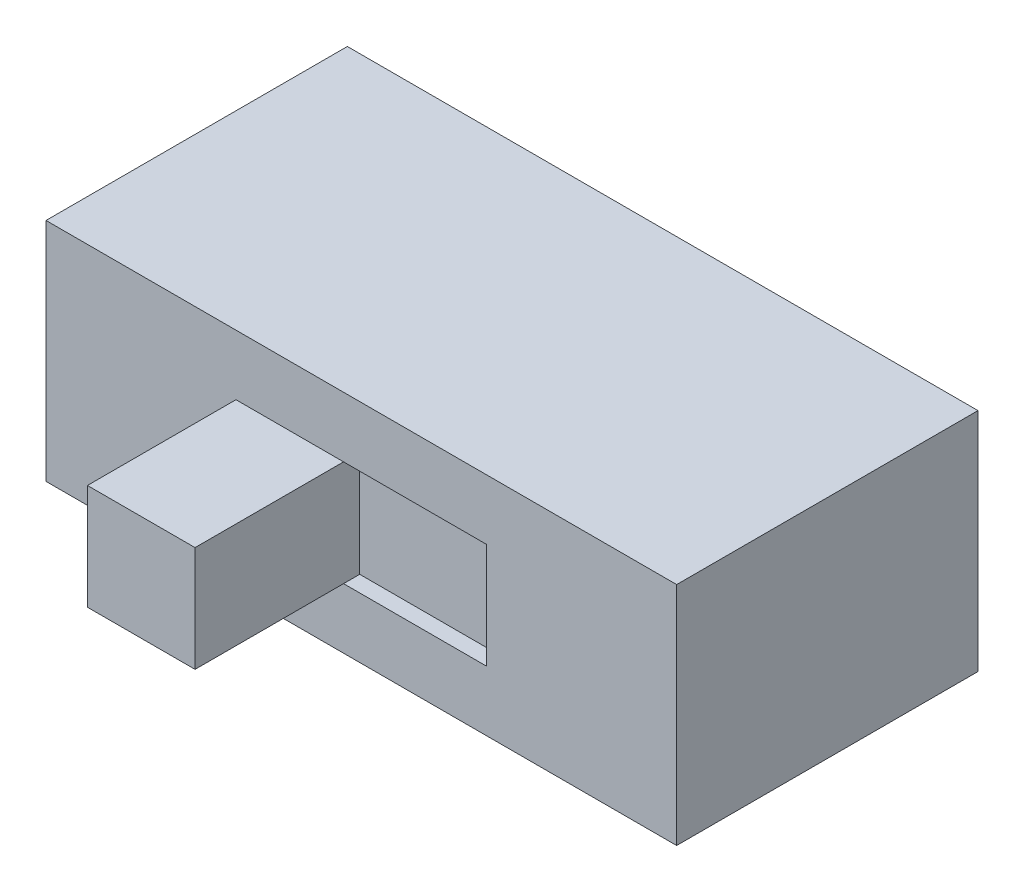
ISO-10303-21;
HEADER;
FILE_DESCRIPTION(('STEP AP214'),'2;1');
FILE_NAME('part.step','',(''),(''),'','','');
FILE_SCHEMA(('AUTOMOTIVE_DESIGN { 1 0 10303 214 1 1 1 1 }'));
ENDSEC;
DATA;
#1=APPLICATION_CONTEXT('core data for automotive mechanical design processes');
#2=APPLICATION_PROTOCOL_DEFINITION('international standard','automotive_design',2000,#1);
#3=PRODUCT_CONTEXT('',#1,'mechanical');
#4=PRODUCT('Part','Part','',(#3));
#5=PRODUCT_RELATED_PRODUCT_CATEGORY('part','',(#4));
#6=PRODUCT_DEFINITION_FORMATION('','',#4);
#7=PRODUCT_DEFINITION_CONTEXT('part definition',#1,'design');
#8=PRODUCT_DEFINITION('design','',#6,#7);
#9=PRODUCT_DEFINITION_SHAPE('','',#8);
#10=(LENGTH_UNIT() NAMED_UNIT(*) SI_UNIT(.MILLI.,.METRE.));
#11=(NAMED_UNIT(*) PLANE_ANGLE_UNIT() SI_UNIT($,.RADIAN.));
#12=(NAMED_UNIT(*) SI_UNIT($,.STERADIAN.) SOLID_ANGLE_UNIT());
#13=UNCERTAINTY_MEASURE_WITH_UNIT(LENGTH_MEASURE(1.E-05),#10,'distance_accuracy_value','');
#14=(GEOMETRIC_REPRESENTATION_CONTEXT(3) GLOBAL_UNCERTAINTY_ASSIGNED_CONTEXT((#13)) GLOBAL_UNIT_ASSIGNED_CONTEXT((#10,
#11,#12)) REPRESENTATION_CONTEXT('',''));
#15=CARTESIAN_POINT('',(0.,0.,0.));
#16=DIRECTION('',(0.,0.,1.));
#17=DIRECTION('',(1.,0.,0.));
#18=AXIS2_PLACEMENT_3D('',#15,#16,#17);
#19=CARTESIAN_POINT('',(5.86000000000001,4.2,-2.8));
#20=DIRECTION('',(-1.,0.,0.));
#21=DIRECTION('',(0.,0.,1.));
#22=AXIS2_PLACEMENT_3D('',#19,#20,#21);
#23=PLANE('',#22);
#24=DIRECTION('',(0.,0.,-1.));
#25=VECTOR('',#24,1.);
#26=CARTESIAN_POINT('',(5.86000000000001,0.,-2.8));
#27=LINE('',#26,#25);
#28=CARTESIAN_POINT('',(5.86000000000001,0.,2.8));
#29=VERTEX_POINT('',#28);
#30=CARTESIAN_POINT('',(5.86000000000001,0.,-2.8));
#31=VERTEX_POINT('',#30);
#32=EDGE_CURVE('E254',#29,#31,#27,.T.);
#33=ORIENTED_EDGE('',*,*,#32,.T.);
#34=DIRECTION('',(0.,-1.,0.));
#35=VECTOR('',#34,1.);
#36=CARTESIAN_POINT('',(5.86000000000001,4.2,-2.8));
#37=LINE('',#36,#35);
#38=CARTESIAN_POINT('',(5.86000000000001,4.2,-2.8));
#39=VERTEX_POINT('',#38);
#40=EDGE_CURVE('E11',#39,#31,#37,.T.);
#41=ORIENTED_EDGE('',*,*,#40,.F.);
#42=DIRECTION('',(0.,0.,-1.));
#43=VECTOR('',#42,1.);
#44=CARTESIAN_POINT('',(5.86000000000001,4.2,-2.8));
#45=LINE('',#44,#43);
#46=CARTESIAN_POINT('',(5.86000000000001,4.2,2.8));
#47=VERTEX_POINT('',#46);
#48=EDGE_CURVE('E258',#47,#39,#45,.T.);
#49=ORIENTED_EDGE('',*,*,#48,.F.);
#50=DIRECTION('',(0.,-1.,0.));
#51=VECTOR('',#50,1.);
#52=CARTESIAN_POINT('',(5.86000000000001,4.2,2.8));
#53=LINE('',#52,#51);
#54=EDGE_CURVE('E266',#47,#29,#53,.T.);
#55=ORIENTED_EDGE('',*,*,#54,.T.);
#56=EDGE_LOOP('',(#33,#41,#49,#55));
#57=FACE_BOUND('',#56,.T.);
#58=ADVANCED_FACE('F52',(#57),#23,.F.);
#59=CARTESIAN_POINT('',(-5.85999999999999,4.2,-2.8));
#60=DIRECTION('',(0.,0.,1.));
#61=DIRECTION('',(1.,0.,0.));
#62=AXIS2_PLACEMENT_3D('',#59,#60,#61);
#63=PLANE('',#62);
#64=DIRECTION('',(-1.,0.,0.));
#65=VECTOR('',#64,1.);
#66=CARTESIAN_POINT('',(-5.85999999999999,0.,-2.8));
#67=LINE('',#66,#65);
#68=CARTESIAN_POINT('',(-5.85999999999999,0.,-2.8));
#69=VERTEX_POINT('',#68);
#70=EDGE_CURVE('E269',#31,#69,#67,.T.);
#71=ORIENTED_EDGE('',*,*,#70,.T.);
#72=DIRECTION('',(0.,-1.,0.));
#73=VECTOR('',#72,1.);
#74=CARTESIAN_POINT('',(-5.85999999999999,4.2,-2.8));
#75=LINE('',#74,#73);
#76=CARTESIAN_POINT('',(-5.85999999999999,4.2,-2.8));
#77=VERTEX_POINT('',#76);
#78=EDGE_CURVE('E62',#77,#69,#75,.T.);
#79=ORIENTED_EDGE('',*,*,#78,.F.);
#80=DIRECTION('',(-1.,0.,0.));
#81=VECTOR('',#80,1.);
#82=CARTESIAN_POINT('',(-5.85999999999999,4.2,-2.8));
#83=LINE('',#82,#81);
#84=EDGE_CURVE('E117',#39,#77,#83,.T.);
#85=ORIENTED_EDGE('',*,*,#84,.F.);
#86=ORIENTED_EDGE('',*,*,#40,.T.);
#87=EDGE_LOOP('',(#71,#79,#85,#86));
#88=FACE_BOUND('',#87,.T.);
#89=ADVANCED_FACE('F308',(#88),#63,.F.);
#90=CARTESIAN_POINT('',(-5.85999999999999,4.2,-2.8));
#91=DIRECTION('',(1.,0.,0.));
#92=DIRECTION('',(0.,0.,-1.));
#93=AXIS2_PLACEMENT_3D('',#90,#91,#92);
#94=PLANE('',#93);
#95=DIRECTION('',(0.,0.,1.));
#96=VECTOR('',#95,1.);
#97=CARTESIAN_POINT('',(-5.85999999999999,0.,-2.8));
#98=LINE('',#97,#96);
#99=CARTESIAN_POINT('',(-5.85999999999999,0.,2.8));
#100=VERTEX_POINT('',#99);
#101=EDGE_CURVE('E272',#69,#100,#98,.T.);
#102=ORIENTED_EDGE('',*,*,#101,.T.);
#103=DIRECTION('',(0.,-1.,0.));
#104=VECTOR('',#103,1.);
#105=CARTESIAN_POINT('',(-5.85999999999999,4.2,2.8));
#106=LINE('',#105,#104);
#107=CARTESIAN_POINT('',(-5.85999999999999,4.2,2.8));
#108=VERTEX_POINT('',#107);
#109=EDGE_CURVE('E278',#108,#100,#106,.T.);
#110=ORIENTED_EDGE('',*,*,#109,.F.);
#111=DIRECTION('',(0.,0.,1.));
#112=VECTOR('',#111,1.);
#113=CARTESIAN_POINT('',(-5.85999999999999,4.2,-2.8));
#114=LINE('',#113,#112);
#115=EDGE_CURVE('E261',#77,#108,#114,.T.);
#116=ORIENTED_EDGE('',*,*,#115,.F.);
#117=ORIENTED_EDGE('',*,*,#78,.T.);
#118=EDGE_LOOP('',(#102,#110,#116,#117));
#119=FACE_BOUND('',#118,.T.);
#120=ADVANCED_FACE('F289',(#119),#94,.F.);
#121=CARTESIAN_POINT('',(-5.85999999999999,4.2,2.8));
#122=DIRECTION('',(0.,0.,-1.));
#123=DIRECTION('',(-1.,0.,0.));
#124=AXIS2_PLACEMENT_3D('',#121,#122,#123);
#125=PLANE('',#124);
#126=DIRECTION('',(1.,0.,0.));
#127=VECTOR('',#126,1.);
#128=CARTESIAN_POINT('',(0.,3.08,2.8));
#129=LINE('',#128,#127);
#130=CARTESIAN_POINT('',(-2.32999999999999,3.08,2.8));
#131=VERTEX_POINT('',#130);
#132=CARTESIAN_POINT('',(-0.329999999999994,3.08,2.8));
#133=VERTEX_POINT('',#132);
#134=EDGE_CURVE('E209',#131,#133,#129,.T.);
#135=ORIENTED_EDGE('',*,*,#134,.T.);
#136=DIRECTION('',(1.,0.,0.));
#137=VECTOR('',#136,1.);
#138=CARTESIAN_POINT('',(0.,3.08,2.8));
#139=LINE('',#138,#137);
#140=CARTESIAN_POINT('',(2.33000000000001,3.08,2.8));
#141=VERTEX_POINT('',#140);
#142=EDGE_CURVE('E198',#133,#141,#139,.T.);
#143=ORIENTED_EDGE('',*,*,#142,.T.);
#144=DIRECTION('',(0.,-1.,0.));
#145=VECTOR('',#144,1.);
#146=CARTESIAN_POINT('',(2.33000000000001,0.,2.8));
#147=LINE('',#146,#145);
#148=CARTESIAN_POINT('',(2.33000000000001,1.12,2.8));
#149=VERTEX_POINT('',#148);
#150=EDGE_CURVE('E183',#141,#149,#147,.T.);
#151=ORIENTED_EDGE('',*,*,#150,.T.);
#152=DIRECTION('',(1.,0.,0.));
#153=VECTOR('',#152,1.);
#154=CARTESIAN_POINT('',(0.,1.12,2.8));
#155=LINE('',#154,#153);
#156=CARTESIAN_POINT('',(-0.329999999999994,1.12,2.8));
#157=VERTEX_POINT('',#156);
#158=EDGE_CURVE('E72',#157,#149,#155,.T.);
#159=ORIENTED_EDGE('',*,*,#158,.F.);
#160=DIRECTION('',(1.,0.,0.));
#161=VECTOR('',#160,1.);
#162=CARTESIAN_POINT('',(0.,1.12,2.8));
#163=LINE('',#162,#161);
#164=CARTESIAN_POINT('',(-2.32999999999999,1.12,2.8));
#165=VERTEX_POINT('',#164);
#166=EDGE_CURVE('E222',#165,#157,#163,.T.);
#167=ORIENTED_EDGE('',*,*,#166,.F.);
#168=DIRECTION('',(0.,-1.,0.));
#169=VECTOR('',#168,1.);
#170=CARTESIAN_POINT('',(-2.32999999999999,0.,2.8));
#171=LINE('',#170,#169);
#172=EDGE_CURVE('E233',#131,#165,#171,.T.);
#173=ORIENTED_EDGE('',*,*,#172,.F.);
#174=EDGE_LOOP('',(#135,#143,#151,#159,#167,#173));
#175=FACE_BOUND('',#174,.T.);
#176=DIRECTION('',(1.,0.,0.));
#177=VECTOR('',#176,1.);
#178=CARTESIAN_POINT('',(-5.85999999999999,0.,2.8));
#179=LINE('',#178,#177);
#180=EDGE_CURVE('E107',#100,#29,#179,.T.);
#181=ORIENTED_EDGE('',*,*,#180,.T.);
#182=ORIENTED_EDGE('',*,*,#54,.F.);
#183=DIRECTION('',(1.,0.,0.));
#184=VECTOR('',#183,1.);
#185=CARTESIAN_POINT('',(-5.85999999999999,4.2,2.8));
#186=LINE('',#185,#184);
#187=EDGE_CURVE('E82',#108,#47,#186,.T.);
#188=ORIENTED_EDGE('',*,*,#187,.F.);
#189=ORIENTED_EDGE('',*,*,#109,.T.);
#190=EDGE_LOOP('',(#181,#182,#188,#189));
#191=FACE_BOUND('',#190,.T.);
#192=ADVANCED_FACE('F293',(#175,#191),#125,.F.);
#193=CARTESIAN_POINT('',(0.,4.2,0.));
#194=DIRECTION('',(0.,1.,0.));
#195=DIRECTION('',(0.,0.,1.));
#196=AXIS2_PLACEMENT_3D('',#193,#194,#195);
#197=PLANE('',#196);
#198=ORIENTED_EDGE('',*,*,#48,.T.);
#199=ORIENTED_EDGE('',*,*,#84,.T.);
#200=ORIENTED_EDGE('',*,*,#115,.T.);
#201=ORIENTED_EDGE('',*,*,#187,.T.);
#202=EDGE_LOOP('',(#198,#199,#200,#201));
#203=FACE_BOUND('',#202,.T.);
#204=ADVANCED_FACE('F300',(#203),#197,.T.);
#205=CARTESIAN_POINT('',(0.,0.,0.));
#206=DIRECTION('',(0.,1.,0.));
#207=DIRECTION('',(0.,0.,1.));
#208=AXIS2_PLACEMENT_3D('',#205,#206,#207);
#209=PLANE('',#208);
#210=ORIENTED_EDGE('',*,*,#32,.F.);
#211=ORIENTED_EDGE('',*,*,#180,.F.);
#212=ORIENTED_EDGE('',*,*,#101,.F.);
#213=ORIENTED_EDGE('',*,*,#70,.F.);
#214=EDGE_LOOP('',(#210,#211,#212,#213));
#215=FACE_BOUND('',#214,.T.);
#216=ADVANCED_FACE('F292',(#215),#209,.F.);
#217=CARTESIAN_POINT('',(-0.329999999999994,0.,5.56));
#218=DIRECTION('',(1.,0.,0.));
#219=DIRECTION('',(0.,1.,0.));
#220=AXIS2_PLACEMENT_3D('',#217,#218,#219);
#221=PLANE('',#220);
#222=DIRECTION('',(0.,0.,-1.));
#223=VECTOR('',#222,1.);
#224=CARTESIAN_POINT('',(-0.329999999999994,1.12,5.56));
#225=LINE('',#224,#223);
#226=CARTESIAN_POINT('',(-0.329999999999994,1.12,5.56));
#227=VERTEX_POINT('',#226);
#228=EDGE_CURVE('E232',#227,#157,#225,.T.);
#229=ORIENTED_EDGE('',*,*,#228,.T.);
#230=DIRECTION('',(0.,0.,1.));
#231=VECTOR('',#230,1.);
#232=CARTESIAN_POINT('',(-0.329999999999994,1.12,2.5));
#233=LINE('',#232,#231);
#234=CARTESIAN_POINT('',(-0.329999999999994,1.12,2.5));
#235=VERTEX_POINT('',#234);
#236=EDGE_CURVE('E211',#235,#157,#233,.T.);
#237=ORIENTED_EDGE('',*,*,#236,.F.);
#238=DIRECTION('',(0.,-1.,0.));
#239=VECTOR('',#238,1.);
#240=CARTESIAN_POINT('',(-0.329999999999994,0.,2.5));
#241=LINE('',#240,#239);
#242=CARTESIAN_POINT('',(-0.329999999999994,3.08,2.5));
#243=VERTEX_POINT('',#242);
#244=EDGE_CURVE('E176',#243,#235,#241,.T.);
#245=ORIENTED_EDGE('',*,*,#244,.F.);
#246=DIRECTION('',(0.,0.,1.));
#247=VECTOR('',#246,1.);
#248=CARTESIAN_POINT('',(-0.329999999999994,3.08,2.5));
#249=LINE('',#248,#247);
#250=EDGE_CURVE('E174',#243,#133,#249,.T.);
#251=ORIENTED_EDGE('',*,*,#250,.T.);
#252=DIRECTION('',(0.,0.,-1.));
#253=VECTOR('',#252,1.);
#254=CARTESIAN_POINT('',(-0.329999999999994,3.08,5.56));
#255=LINE('',#254,#253);
#256=CARTESIAN_POINT('',(-0.329999999999994,3.08,5.56));
#257=VERTEX_POINT('',#256);
#258=EDGE_CURVE('E253',#257,#133,#255,.T.);
#259=ORIENTED_EDGE('',*,*,#258,.F.);
#260=DIRECTION('',(0.,-1.,0.));
#261=VECTOR('',#260,1.);
#262=CARTESIAN_POINT('',(-0.329999999999994,0.,5.56));
#263=LINE('',#262,#261);
#264=EDGE_CURVE('E216',#257,#227,#263,.T.);
#265=ORIENTED_EDGE('',*,*,#264,.T.);
#266=EDGE_LOOP('',(#229,#237,#245,#251,#259,#265));
#267=FACE_BOUND('',#266,.T.);
#268=ADVANCED_FACE('F321',(#267),#221,.T.);
#269=CARTESIAN_POINT('',(0.,3.08,5.56));
#270=DIRECTION('',(0.,1.,0.));
#271=DIRECTION('',(0.,0.,1.));
#272=AXIS2_PLACEMENT_3D('',#269,#270,#271);
#273=PLANE('',#272);
#274=ORIENTED_EDGE('',*,*,#134,.F.);
#275=DIRECTION('',(0.,0.,-1.));
#276=VECTOR('',#275,1.);
#277=CARTESIAN_POINT('',(-2.32999999999999,3.08,5.56));
#278=LINE('',#277,#276);
#279=CARTESIAN_POINT('',(-2.32999999999999,3.08,5.56));
#280=VERTEX_POINT('',#279);
#281=EDGE_CURVE('E250',#280,#131,#278,.T.);
#282=ORIENTED_EDGE('',*,*,#281,.F.);
#283=DIRECTION('',(1.,0.,0.));
#284=VECTOR('',#283,1.);
#285=CARTESIAN_POINT('',(0.,3.08,5.56));
#286=LINE('',#285,#284);
#287=EDGE_CURVE('E219',#280,#257,#286,.T.);
#288=ORIENTED_EDGE('',*,*,#287,.T.);
#289=ORIENTED_EDGE('',*,*,#258,.T.);
#290=EDGE_LOOP('',(#274,#282,#288,#289));
#291=FACE_BOUND('',#290,.T.);
#292=ADVANCED_FACE('F332',(#291),#273,.T.);
#293=CARTESIAN_POINT('',(-2.32999999999999,0.,5.56));
#294=DIRECTION('',(1.,0.,0.));
#295=DIRECTION('',(0.,0.,-1.));
#296=AXIS2_PLACEMENT_3D('',#293,#294,#295);
#297=PLANE('',#296);
#298=ORIENTED_EDGE('',*,*,#172,.T.);
#299=DIRECTION('',(0.,0.,-1.));
#300=VECTOR('',#299,1.);
#301=CARTESIAN_POINT('',(-2.32999999999999,1.12,5.56));
#302=LINE('',#301,#300);
#303=CARTESIAN_POINT('',(-2.32999999999999,1.12,5.56));
#304=VERTEX_POINT('',#303);
#305=EDGE_CURVE('E241',#304,#165,#302,.T.);
#306=ORIENTED_EDGE('',*,*,#305,.F.);
#307=DIRECTION('',(0.,-1.,0.));
#308=VECTOR('',#307,1.);
#309=CARTESIAN_POINT('',(-2.32999999999999,0.,5.56));
#310=LINE('',#309,#308);
#311=EDGE_CURVE('E223',#280,#304,#310,.T.);
#312=ORIENTED_EDGE('',*,*,#311,.F.);
#313=ORIENTED_EDGE('',*,*,#281,.T.);
#314=EDGE_LOOP('',(#298,#306,#312,#313));
#315=FACE_BOUND('',#314,.T.);
#316=ADVANCED_FACE('F331',(#315),#297,.F.);
#317=CARTESIAN_POINT('',(0.,1.12,5.56));
#318=DIRECTION('',(0.,1.,0.));
#319=DIRECTION('',(0.,0.,1.));
#320=AXIS2_PLACEMENT_3D('',#317,#318,#319);
#321=PLANE('',#320);
#322=ORIENTED_EDGE('',*,*,#166,.T.);
#323=ORIENTED_EDGE('',*,*,#228,.F.);
#324=DIRECTION('',(1.,0.,0.));
#325=VECTOR('',#324,1.);
#326=CARTESIAN_POINT('',(0.,1.12,5.56));
#327=LINE('',#326,#325);
#328=EDGE_CURVE('E229',#304,#227,#327,.T.);
#329=ORIENTED_EDGE('',*,*,#328,.F.);
#330=ORIENTED_EDGE('',*,*,#305,.T.);
#331=EDGE_LOOP('',(#322,#323,#329,#330));
#332=FACE_BOUND('',#331,.T.);
#333=ADVANCED_FACE('F342',(#332),#321,.F.);
#334=CARTESIAN_POINT('',(0.,0.,5.56));
#335=DIRECTION('',(0.,0.,1.));
#336=DIRECTION('',(1.,0.,0.));
#337=AXIS2_PLACEMENT_3D('',#334,#335,#336);
#338=PLANE('',#337);
#339=ORIENTED_EDGE('',*,*,#264,.F.);
#340=ORIENTED_EDGE('',*,*,#287,.F.);
#341=ORIENTED_EDGE('',*,*,#311,.T.);
#342=ORIENTED_EDGE('',*,*,#328,.T.);
#343=EDGE_LOOP('',(#339,#340,#341,#342));
#344=FACE_BOUND('',#343,.T.);
#345=ADVANCED_FACE('F345',(#344),#338,.T.);
#346=CARTESIAN_POINT('',(2.33000000000001,0.,2.5));
#347=DIRECTION('',(-1.,0.,0.));
#348=DIRECTION('',(0.,-1.,0.));
#349=AXIS2_PLACEMENT_3D('',#346,#347,#348);
#350=PLANE('',#349);
#351=ORIENTED_EDGE('',*,*,#150,.F.);
#352=DIRECTION('',(0.,0.,1.));
#353=VECTOR('',#352,1.);
#354=CARTESIAN_POINT('',(2.33000000000001,3.08,2.5));
#355=LINE('',#354,#353);
#356=CARTESIAN_POINT('',(2.33000000000001,3.08,2.5));
#357=VERTEX_POINT('',#356);
#358=EDGE_CURVE('E172',#357,#141,#355,.T.);
#359=ORIENTED_EDGE('',*,*,#358,.F.);
#360=DIRECTION('',(0.,-1.,0.));
#361=VECTOR('',#360,1.);
#362=CARTESIAN_POINT('',(2.33000000000001,0.,2.5));
#363=LINE('',#362,#361);
#364=CARTESIAN_POINT('',(2.33000000000001,1.12,2.5));
#365=VERTEX_POINT('',#364);
#366=EDGE_CURVE('E178',#357,#365,#363,.T.);
#367=ORIENTED_EDGE('',*,*,#366,.T.);
#368=DIRECTION('',(0.,0.,1.));
#369=VECTOR('',#368,1.);
#370=CARTESIAN_POINT('',(2.33000000000001,1.12,2.5));
#371=LINE('',#370,#369);
#372=EDGE_CURVE('E210',#365,#149,#371,.T.);
#373=ORIENTED_EDGE('',*,*,#372,.T.);
#374=EDGE_LOOP('',(#351,#359,#367,#373));
#375=FACE_BOUND('',#374,.T.);
#376=ADVANCED_FACE('F181',(#375),#350,.T.);
#377=CARTESIAN_POINT('',(0.,1.12,2.5));
#378=DIRECTION('',(0.,-1.,0.));
#379=DIRECTION('',(0.,0.,-1.));
#380=AXIS2_PLACEMENT_3D('',#377,#378,#379);
#381=PLANE('',#380);
#382=ORIENTED_EDGE('',*,*,#158,.T.);
#383=ORIENTED_EDGE('',*,*,#372,.F.);
#384=DIRECTION('',(1.,0.,0.));
#385=VECTOR('',#384,1.);
#386=CARTESIAN_POINT('',(0.,1.12,2.5));
#387=LINE('',#386,#385);
#388=EDGE_CURVE('E189',#235,#365,#387,.T.);
#389=ORIENTED_EDGE('',*,*,#388,.F.);
#390=ORIENTED_EDGE('',*,*,#236,.T.);
#391=EDGE_LOOP('',(#382,#383,#389,#390));
#392=FACE_BOUND('',#391,.T.);
#393=ADVANCED_FACE('F413',(#392),#381,.F.);
#394=CARTESIAN_POINT('',(0.,3.08,2.5));
#395=DIRECTION('',(0.,-1.,0.));
#396=DIRECTION('',(0.,0.,-1.));
#397=AXIS2_PLACEMENT_3D('',#394,#395,#396);
#398=PLANE('',#397);
#399=ORIENTED_EDGE('',*,*,#142,.F.);
#400=ORIENTED_EDGE('',*,*,#250,.F.);
#401=DIRECTION('',(1.,0.,0.));
#402=VECTOR('',#401,1.);
#403=CARTESIAN_POINT('',(0.,3.08,2.5));
#404=LINE('',#403,#402);
#405=EDGE_CURVE('E170',#243,#357,#404,.T.);
#406=ORIENTED_EDGE('',*,*,#405,.T.);
#407=ORIENTED_EDGE('',*,*,#358,.T.);
#408=EDGE_LOOP('',(#399,#400,#406,#407));
#409=FACE_BOUND('',#408,.T.);
#410=ADVANCED_FACE('F168',(#409),#398,.T.);
#411=CARTESIAN_POINT('',(0.,0.,2.5));
#412=DIRECTION('',(0.,0.,1.));
#413=DIRECTION('',(1.,0.,0.));
#414=AXIS2_PLACEMENT_3D('',#411,#412,#413);
#415=PLANE('',#414);
#416=ORIENTED_EDGE('',*,*,#366,.F.);
#417=ORIENTED_EDGE('',*,*,#405,.F.);
#418=ORIENTED_EDGE('',*,*,#244,.T.);
#419=ORIENTED_EDGE('',*,*,#388,.T.);
#420=EDGE_LOOP('',(#416,#417,#418,#419));
#421=FACE_BOUND('',#420,.T.);
#422=ADVANCED_FACE('F192',(#421),#415,.T.);
#423=CLOSED_SHELL('',(#58,#89,#120,#192,#204,#216,#268,#292,#316,#333,#345,#376,#393,#410,#422));
#424=MANIFOLD_SOLID_BREP('B2',#423);
#425=ADVANCED_BREP_SHAPE_REPRESENTATION('',(#18,#424),#14);
#426=SHAPE_DEFINITION_REPRESENTATION(#9,#425);
ENDSEC;
END-ISO-10303-21;
